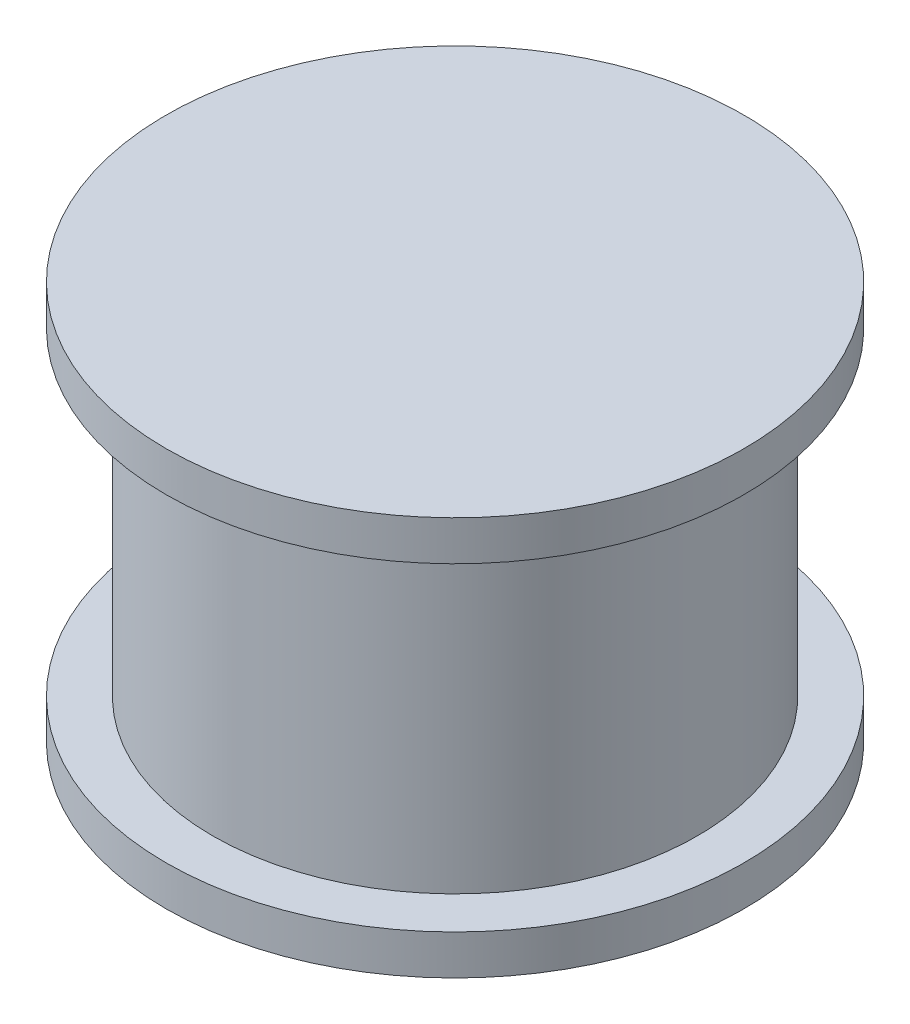
ISO-10303-21;
HEADER;
FILE_DESCRIPTION(('STEP AP214'),'2;1');
FILE_NAME('part.step','',(''),(''),'','','');
FILE_SCHEMA(('AUTOMOTIVE_DESIGN { 1 0 10303 214 1 1 1 1 }'));
ENDSEC;
DATA;
#1=APPLICATION_CONTEXT('core data for automotive mechanical design processes');
#2=APPLICATION_PROTOCOL_DEFINITION('international standard','automotive_design',2000,#1);
#3=PRODUCT_CONTEXT('',#1,'mechanical');
#4=PRODUCT('Part','Part','',(#3));
#5=PRODUCT_RELATED_PRODUCT_CATEGORY('part','',(#4));
#6=PRODUCT_DEFINITION_FORMATION('','',#4);
#7=PRODUCT_DEFINITION_CONTEXT('part definition',#1,'design');
#8=PRODUCT_DEFINITION('design','',#6,#7);
#9=PRODUCT_DEFINITION_SHAPE('','',#8);
#10=(LENGTH_UNIT() NAMED_UNIT(*) SI_UNIT(.MILLI.,.METRE.));
#11=(NAMED_UNIT(*) PLANE_ANGLE_UNIT() SI_UNIT($,.RADIAN.));
#12=(NAMED_UNIT(*) SI_UNIT($,.STERADIAN.) SOLID_ANGLE_UNIT());
#13=UNCERTAINTY_MEASURE_WITH_UNIT(LENGTH_MEASURE(1.E-05),#10,'distance_accuracy_value','');
#14=(GEOMETRIC_REPRESENTATION_CONTEXT(3) GLOBAL_UNCERTAINTY_ASSIGNED_CONTEXT((#13)) GLOBAL_UNIT_ASSIGNED_CONTEXT((#10,
#11,#12)) REPRESENTATION_CONTEXT('',''));
#15=CARTESIAN_POINT('',(0.,0.,0.));
#16=DIRECTION('',(0.,0.,1.));
#17=DIRECTION('',(1.,0.,0.));
#18=AXIS2_PLACEMENT_3D('',#15,#16,#17);
#19=CARTESIAN_POINT('',(0.,2.,0.));
#20=DIRECTION('',(0.,-1.,0.));
#21=DIRECTION('',(0.,0.,-1.));
#22=AXIS2_PLACEMENT_3D('',#19,#20,#21);
#23=CYLINDRICAL_SURFACE('',#22,14.5);
#24=CARTESIAN_POINT('',(0.,2.,0.));
#25=DIRECTION('',(0.,1.,0.));
#26=DIRECTION('',(0.,0.,1.));
#27=AXIS2_PLACEMENT_3D('',#24,#25,#26);
#28=CIRCLE('',#27,14.5);
#29=CARTESIAN_POINT('',(0.,2.,14.5));
#30=VERTEX_POINT('',#29);
#31=EDGE_CURVE('E45',#30,#30,#28,.T.);
#32=ORIENTED_EDGE('',*,*,#31,.F.);
#33=EDGE_LOOP('',(#32));
#34=FACE_BOUND('',#33,.T.);
#35=CARTESIAN_POINT('',(0.,0.,0.));
#36=DIRECTION('',(0.,1.,0.));
#37=DIRECTION('',(0.,0.,1.));
#38=AXIS2_PLACEMENT_3D('',#35,#36,#37);
#39=CIRCLE('',#38,14.5);
#40=CARTESIAN_POINT('',(0.,0.,14.5));
#41=VERTEX_POINT('',#40);
#42=EDGE_CURVE('E40',#41,#41,#39,.T.);
#43=ORIENTED_EDGE('',*,*,#42,.T.);
#44=EDGE_LOOP('',(#43));
#45=FACE_BOUND('',#44,.T.);
#46=ADVANCED_FACE('F37',(#34,#45),#23,.T.);
#47=CARTESIAN_POINT('',(0.,2.,0.));
#48=DIRECTION('',(0.,1.,0.));
#49=DIRECTION('',(0.,0.,1.));
#50=AXIS2_PLACEMENT_3D('',#47,#48,#49);
#51=PLANE('',#50);
#52=CARTESIAN_POINT('',(0.,2.,0.));
#53=DIRECTION('',(0.,1.,0.));
#54=DIRECTION('',(0.,0.,1.));
#55=AXIS2_PLACEMENT_3D('',#52,#53,#54);
#56=CIRCLE('',#55,12.16);
#57=CARTESIAN_POINT('',(0.,2.,12.16));
#58=VERTEX_POINT('',#57);
#59=EDGE_CURVE('E10',#58,#58,#56,.T.);
#60=ORIENTED_EDGE('',*,*,#59,.F.);
#61=EDGE_LOOP('',(#60));
#62=FACE_BOUND('',#61,.T.);
#63=ORIENTED_EDGE('',*,*,#31,.T.);
#64=EDGE_LOOP('',(#63));
#65=FACE_BOUND('',#64,.T.);
#66=ADVANCED_FACE('F83',(#62,#65),#51,.T.);
#67=CARTESIAN_POINT('',(0.,0.,0.));
#68=DIRECTION('',(0.,1.,0.));
#69=DIRECTION('',(0.,0.,1.));
#70=AXIS2_PLACEMENT_3D('',#67,#68,#69);
#71=PLANE('',#70);
#72=ORIENTED_EDGE('',*,*,#42,.F.);
#73=EDGE_LOOP('',(#72));
#74=FACE_BOUND('',#73,.T.);
#75=ADVANCED_FACE('F88',(#74),#71,.F.);
#76=CARTESIAN_POINT('',(0.,18.,0.));
#77=DIRECTION('',(0.,-1.,0.));
#78=DIRECTION('',(0.,0.,-1.));
#79=AXIS2_PLACEMENT_3D('',#76,#77,#78);
#80=CYLINDRICAL_SURFACE('',#79,12.16);
#81=CARTESIAN_POINT('',(0.,18.,0.));
#82=DIRECTION('',(0.,1.,0.));
#83=DIRECTION('',(0.,0.,1.));
#84=AXIS2_PLACEMENT_3D('',#81,#82,#83);
#85=CIRCLE('',#84,12.16);
#86=CARTESIAN_POINT('',(0.,18.,12.16));
#87=VERTEX_POINT('',#86);
#88=EDGE_CURVE('E52',#87,#87,#85,.T.);
#89=ORIENTED_EDGE('',*,*,#88,.F.);
#90=EDGE_LOOP('',(#89));
#91=FACE_BOUND('',#90,.T.);
#92=ORIENTED_EDGE('',*,*,#59,.T.);
#93=EDGE_LOOP('',(#92));
#94=FACE_BOUND('',#93,.T.);
#95=ADVANCED_FACE('F70',(#91,#94),#80,.T.);
#96=CARTESIAN_POINT('',(0.,20.,0.));
#97=DIRECTION('',(0.,-1.,0.));
#98=DIRECTION('',(0.,0.,-1.));
#99=AXIS2_PLACEMENT_3D('',#96,#97,#98);
#100=CYLINDRICAL_SURFACE('',#99,14.5);
#101=CARTESIAN_POINT('',(0.,20.,0.));
#102=DIRECTION('',(0.,1.,0.));
#103=DIRECTION('',(0.,0.,1.));
#104=AXIS2_PLACEMENT_3D('',#101,#102,#103);
#105=CIRCLE('',#104,14.5);
#106=CARTESIAN_POINT('',(0.,20.,14.5));
#107=VERTEX_POINT('',#106);
#108=EDGE_CURVE('E56',#107,#107,#105,.T.);
#109=ORIENTED_EDGE('',*,*,#108,.F.);
#110=EDGE_LOOP('',(#109));
#111=FACE_BOUND('',#110,.T.);
#112=CARTESIAN_POINT('',(0.,18.,0.));
#113=DIRECTION('',(0.,1.,0.));
#114=DIRECTION('',(0.,0.,1.));
#115=AXIS2_PLACEMENT_3D('',#112,#113,#114);
#116=CIRCLE('',#115,14.5);
#117=CARTESIAN_POINT('',(0.,18.,14.5));
#118=VERTEX_POINT('',#117);
#119=EDGE_CURVE('E57',#118,#118,#116,.T.);
#120=ORIENTED_EDGE('',*,*,#119,.T.);
#121=EDGE_LOOP('',(#120));
#122=FACE_BOUND('',#121,.T.);
#123=ADVANCED_FACE('F67',(#111,#122),#100,.T.);
#124=CARTESIAN_POINT('',(0.,20.,0.));
#125=DIRECTION('',(0.,1.,0.));
#126=DIRECTION('',(0.,0.,1.));
#127=AXIS2_PLACEMENT_3D('',#124,#125,#126);
#128=PLANE('',#127);
#129=ORIENTED_EDGE('',*,*,#108,.T.);
#130=EDGE_LOOP('',(#129));
#131=FACE_BOUND('',#130,.T.);
#132=ADVANCED_FACE('F65',(#131),#128,.T.);
#133=CARTESIAN_POINT('',(0.,18.,0.));
#134=DIRECTION('',(0.,1.,0.));
#135=DIRECTION('',(0.,0.,1.));
#136=AXIS2_PLACEMENT_3D('',#133,#134,#135);
#137=PLANE('',#136);
#138=ORIENTED_EDGE('',*,*,#88,.T.);
#139=EDGE_LOOP('',(#138));
#140=FACE_BOUND('',#139,.T.);
#141=ORIENTED_EDGE('',*,*,#119,.F.);
#142=EDGE_LOOP('',(#141));
#143=FACE_BOUND('',#142,.T.);
#144=ADVANCED_FACE('F74',(#140,#143),#137,.F.);
#145=CLOSED_SHELL('',(#46,#66,#75,#95,#123,#132,#144));
#146=MANIFOLD_SOLID_BREP('B2',#145);
#147=ADVANCED_BREP_SHAPE_REPRESENTATION('',(#18,#146),#14);
#148=SHAPE_DEFINITION_REPRESENTATION(#9,#147);
ENDSEC;
END-ISO-10303-21;
